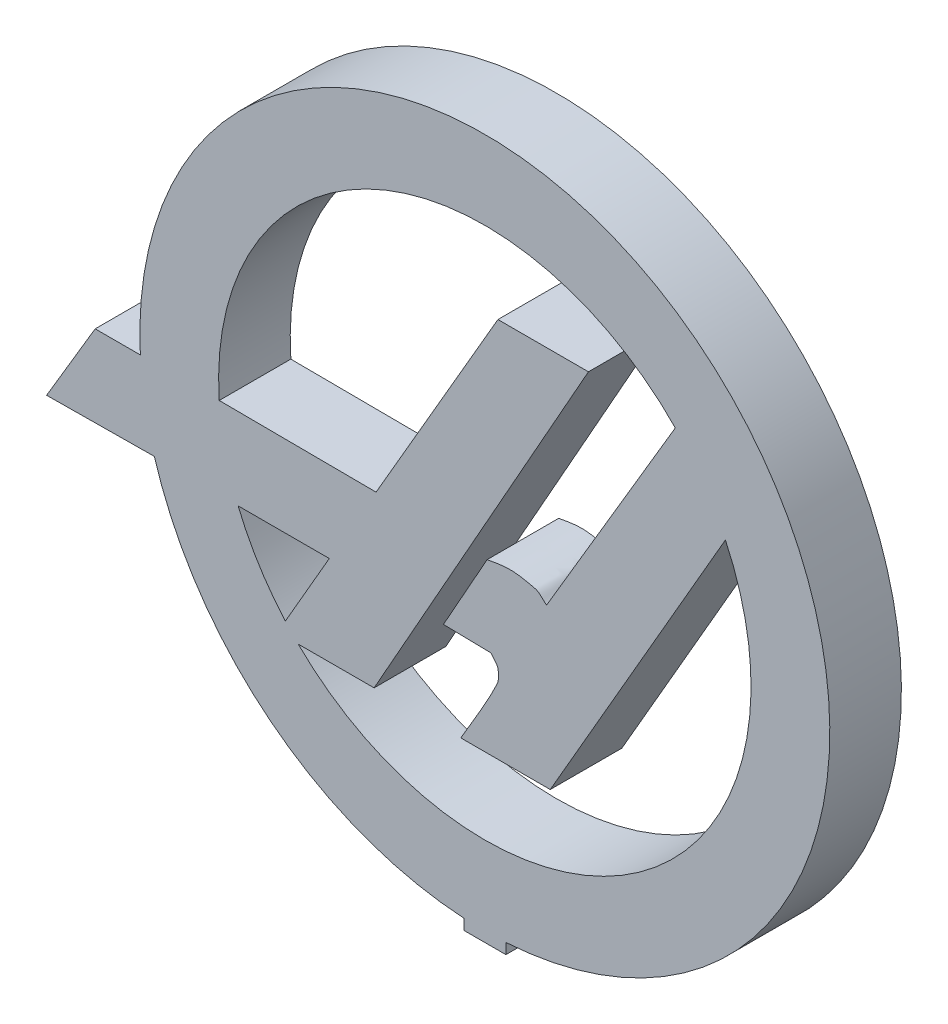
ISO-10303-21;
HEADER;
FILE_DESCRIPTION(('STEP AP214'),'2;1');
FILE_NAME('part.step','',(''),(''),'','','');
FILE_SCHEMA(('AUTOMOTIVE_DESIGN { 1 0 10303 214 1 1 1 1 }'));
ENDSEC;
DATA;
#1=APPLICATION_CONTEXT('core data for automotive mechanical design processes');
#2=APPLICATION_PROTOCOL_DEFINITION('international standard','automotive_design',2000,#1);
#3=PRODUCT_CONTEXT('',#1,'mechanical');
#4=PRODUCT('Part','Part','',(#3));
#5=PRODUCT_RELATED_PRODUCT_CATEGORY('part','',(#4));
#6=PRODUCT_DEFINITION_FORMATION('','',#4);
#7=PRODUCT_DEFINITION_CONTEXT('part definition',#1,'design');
#8=PRODUCT_DEFINITION('design','',#6,#7);
#9=PRODUCT_DEFINITION_SHAPE('','',#8);
#10=(LENGTH_UNIT() NAMED_UNIT(*) SI_UNIT(.MILLI.,.METRE.));
#11=(NAMED_UNIT(*) PLANE_ANGLE_UNIT() SI_UNIT($,.RADIAN.));
#12=(NAMED_UNIT(*) SI_UNIT($,.STERADIAN.) SOLID_ANGLE_UNIT());
#13=UNCERTAINTY_MEASURE_WITH_UNIT(LENGTH_MEASURE(1.E-05),#10,'distance_accuracy_value','');
#14=(GEOMETRIC_REPRESENTATION_CONTEXT(3) GLOBAL_UNCERTAINTY_ASSIGNED_CONTEXT((#13)) GLOBAL_UNIT_ASSIGNED_CONTEXT((#10,
#11,#12)) REPRESENTATION_CONTEXT('',''));
#15=CARTESIAN_POINT('',(0.,0.,0.));
#16=DIRECTION('',(0.,0.,1.));
#17=DIRECTION('',(1.,0.,0.));
#18=AXIS2_PLACEMENT_3D('',#15,#16,#17);
#19=CARTESIAN_POINT('',(429.035110328708,358.774337279412,38.2200510177394));
#20=DIRECTION('',(0.020467844201998,0.999790511734195,0.));
#21=DIRECTION('',(-0.999790511734195,0.020467844201998,0.));
#22=AXIS2_PLACEMENT_3D('',#19,#20,#21);
#23=PLANE('',#22);
#24=DIRECTION('',(0.999790511734195,-0.020467844201998,0.));
#25=VECTOR('',#24,1.);
#26=CARTESIAN_POINT('',(429.035110328708,358.774337279412,35.2800510177394));
#27=LINE('',#26,#25);
#28=CARTESIAN_POINT('',(445.37492535625,358.439826415037,35.2800510177394));
#29=VERTEX_POINT('',#28);
#30=CARTESIAN_POINT('',(447.32880091344,358.399826415012,35.2800510177394));
#31=VERTEX_POINT('',#30);
#32=EDGE_CURVE('E419',#29,#31,#27,.T.);
#33=ORIENTED_EDGE('',*,*,#32,.T.);
#34=DIRECTION('',(0.,0.,-1.));
#35=VECTOR('',#34,1.);
#36=CARTESIAN_POINT('',(447.32880091344,358.399826415012,38.2200510177394));
#37=LINE('',#36,#35);
#38=CARTESIAN_POINT('',(447.32880091344,358.399826415012,38.2200510177394));
#39=VERTEX_POINT('',#38);
#40=EDGE_CURVE('E11',#39,#31,#37,.T.);
#41=ORIENTED_EDGE('',*,*,#40,.F.);
#42=DIRECTION('',(0.999790511734195,-0.020467844201998,0.));
#43=VECTOR('',#42,1.);
#44=CARTESIAN_POINT('',(429.035110328708,358.774337279412,38.2200510177394));
#45=LINE('',#44,#43);
#46=CARTESIAN_POINT('',(445.37492535625,358.439826415037,38.2200510177394));
#47=VERTEX_POINT('',#46);
#48=EDGE_CURVE('E302',#47,#39,#45,.T.);
#49=ORIENTED_EDGE('',*,*,#48,.F.);
#50=DIRECTION('',(0.,0.,-1.));
#51=VECTOR('',#50,1.);
#52=CARTESIAN_POINT('',(445.37492535625,358.439826415037,38.2200510177394));
#53=LINE('',#52,#51);
#54=EDGE_CURVE('E360',#47,#29,#53,.T.);
#55=ORIENTED_EDGE('',*,*,#54,.T.);
#56=EDGE_LOOP('',(#33,#41,#49,#55));
#57=FACE_BOUND('',#56,.T.);
#58=ADVANCED_FACE('F37',(#57),#23,.F.);
#59=CARTESIAN_POINT('',(447.32880091344,358.399826415012,38.2200510177394));
#60=CARTESIAN_POINT('',(447.422134246773,358.266493081679,38.2200510177394));
#61=CARTESIAN_POINT('',(447.570818514459,358.158086410768,38.2200510177394));
#62=CARTESIAN_POINT('',(447.60880091344,357.999826415012,38.2200510177394));
#63=CARTESIAN_POINT('',(447.655579110257,357.804917261609,38.2200510177394));
#64=CARTESIAN_POINT('',(447.653933510983,357.581293267669,38.2200510177394));
#65=CARTESIAN_POINT('',(447.56880091344,357.399826415012,38.2200510177394));
#66=CARTESIAN_POINT('',(447.140322042841,356.486489875051,38.2200510177394));
#67=CARTESIAN_POINT('',(446.582134246773,355.639826415012,38.2200510177394));
#68=CARTESIAN_POINT('',(446.08880091344,354.759826415012,38.2200510177394));
#69=B_SPLINE_CURVE_WITH_KNOTS('',3,(#59,#60,#61,#62,#63,#64,#65,#66,#67,#68),.UNSPECIFIED.,.F.,
.F.,(4,3,3,4),(0.,1.,2.,3.),.UNSPECIFIED.);
#70=DIRECTION('',(0.,0.,-1.));
#71=VECTOR('',#70,1.);
#72=SURFACE_OF_LINEAR_EXTRUSION('',#69,#71);
#73=CARTESIAN_POINT('',(447.32880091344,358.399826415012,35.2800510177394));
#74=CARTESIAN_POINT('',(447.422134246773,358.266493081679,35.2800510177394));
#75=CARTESIAN_POINT('',(447.570818514459,358.158086410768,35.2800510177394));
#76=CARTESIAN_POINT('',(447.60880091344,357.999826415012,35.2800510177394));
#77=CARTESIAN_POINT('',(447.655579110257,357.804917261609,35.2800510177394));
#78=CARTESIAN_POINT('',(447.653933510983,357.581293267669,35.2800510177394));
#79=CARTESIAN_POINT('',(447.56880091344,357.399826415012,35.2800510177394));
#80=CARTESIAN_POINT('',(447.140322042841,356.486489875051,35.2800510177394));
#81=CARTESIAN_POINT('',(446.582134246773,355.639826415012,35.2800510177394));
#82=CARTESIAN_POINT('',(446.08880091344,354.759826415012,35.2800510177394));
#83=B_SPLINE_CURVE_WITH_KNOTS('',3,(#73,#74,#75,#76,#77,#78,#79,#80,#81,#82),.UNSPECIFIED.,.F.,
.F.,(4,3,3,4),(0.,1.,2.,3.),.UNSPECIFIED.);
#84=CARTESIAN_POINT('',(446.08880091344,354.759826415012,35.2800510177394));
#85=VERTEX_POINT('',#84);
#86=EDGE_CURVE('E422',#31,#85,#83,.T.);
#87=ORIENTED_EDGE('',*,*,#86,.T.);
#88=DIRECTION('',(0.,0.,-1.));
#89=VECTOR('',#88,1.);
#90=CARTESIAN_POINT('',(446.08880091344,354.759826415012,38.2200510177394));
#91=LINE('',#90,#89);
#92=CARTESIAN_POINT('',(446.08880091344,354.759826415012,38.2200510177394));
#93=VERTEX_POINT('',#92);
#94=EDGE_CURVE('E47',#93,#85,#91,.T.);
#95=ORIENTED_EDGE('',*,*,#94,.F.);
#96=EDGE_CURVE('E295',#39,#93,#69,.T.);
#97=ORIENTED_EDGE('',*,*,#96,.F.);
#98=ORIENTED_EDGE('',*,*,#40,.T.);
#99=EDGE_LOOP('',(#87,#95,#97,#98));
#100=FACE_BOUND('',#99,.T.);
#101=ADVANCED_FACE('F288',(#100),#72,.F.);
#102=CARTESIAN_POINT('',(428.808800913439,354.759826415012,38.2200510177394));
#103=DIRECTION('',(0.,1.,0.));
#104=DIRECTION('',(0.,0.,1.));
#105=AXIS2_PLACEMENT_3D('',#102,#103,#104);
#106=PLANE('',#105);
#107=DIRECTION('',(1.,0.,0.));
#108=VECTOR('',#107,1.);
#109=CARTESIAN_POINT('',(428.808800913439,354.759826415012,35.2800510177394));
#110=LINE('',#109,#108);
#111=CARTESIAN_POINT('',(449.760149876209,354.759826415012,35.2800510177394));
#112=VERTEX_POINT('',#111);
#113=EDGE_CURVE('E426',#85,#112,#110,.T.);
#114=ORIENTED_EDGE('',*,*,#113,.T.);
#115=DIRECTION('',(0.,0.,-1.));
#116=VECTOR('',#115,1.);
#117=CARTESIAN_POINT('',(449.760149876209,354.759826415012,38.2200510177394));
#118=LINE('',#117,#116);
#119=CARTESIAN_POINT('',(449.760149876209,354.759826415012,38.2200510177394));
#120=VERTEX_POINT('',#119);
#121=EDGE_CURVE('E348',#120,#112,#118,.T.);
#122=ORIENTED_EDGE('',*,*,#121,.F.);
#123=DIRECTION('',(1.,0.,0.));
#124=VECTOR('',#123,1.);
#125=CARTESIAN_POINT('',(428.808800913439,354.759826415012,38.2200510177394));
#126=LINE('',#125,#124);
#127=EDGE_CURVE('E301',#93,#120,#126,.T.);
#128=ORIENTED_EDGE('',*,*,#127,.F.);
#129=ORIENTED_EDGE('',*,*,#94,.T.);
#130=EDGE_LOOP('',(#114,#122,#128,#129));
#131=FACE_BOUND('',#130,.T.);
#132=ADVANCED_FACE('F284',(#131),#106,.F.);
#133=CARTESIAN_POINT('',(441.483641457042,340.40959906418,38.2200510177394));
#134=DIRECTION('',(-0.866250088911705,0.499610631852908,0.));
#135=DIRECTION('',(-0.499610631852908,-0.866250088911706,0.));
#136=AXIS2_PLACEMENT_3D('',#133,#134,#135);
#137=PLANE('',#136);
#138=DIRECTION('',(0.499610631852909,0.866250088911706,0.));
#139=VECTOR('',#138,1.);
#140=CARTESIAN_POINT('',(441.483641457042,340.40959906418,35.2800510177394));
#141=LINE('',#140,#139);
#142=CARTESIAN_POINT('',(456.953102289351,367.231329762156,35.2800510177394));
#143=VERTEX_POINT('',#142);
#144=EDGE_CURVE('E431',#112,#143,#141,.T.);
#145=ORIENTED_EDGE('',*,*,#144,.T.);
#146=DIRECTION('',(0.,0.,-1.));
#147=VECTOR('',#146,1.);
#148=CARTESIAN_POINT('',(456.953102289351,367.231329762156,38.2200510177394));
#149=LINE('',#148,#147);
#150=CARTESIAN_POINT('',(456.953102289351,367.231329762156,38.2200510177394));
#151=VERTEX_POINT('',#150);
#152=EDGE_CURVE('E346',#151,#143,#149,.T.);
#153=ORIENTED_EDGE('',*,*,#152,.F.);
#154=DIRECTION('',(0.499610631852909,0.866250088911706,0.));
#155=VECTOR('',#154,1.);
#156=CARTESIAN_POINT('',(441.483641457042,340.40959906418,38.2200510177394));
#157=LINE('',#156,#155);
#158=EDGE_CURVE('E308',#120,#151,#157,.T.);
#159=ORIENTED_EDGE('',*,*,#158,.F.);
#160=ORIENTED_EDGE('',*,*,#121,.T.);
#161=EDGE_LOOP('',(#145,#153,#159,#160));
#162=FACE_BOUND('',#161,.T.);
#163=ADVANCED_FACE('F280',(#162),#137,.F.);
#164=CARTESIAN_POINT('',(447.074162187186,362.551716003941,38.2200510177394));
#165=DIRECTION('',(0.,0.,-1.));
#166=DIRECTION('',(-1.,0.,0.));
#167=AXIS2_PLACEMENT_3D('',#164,#165,#166);
#168=CYLINDRICAL_SURFACE('',#167,10.9312507275352);
#169=CARTESIAN_POINT('',(447.074162187186,362.551716003941,35.2800510177394));
#170=DIRECTION('',(0.,0.,1.));
#171=DIRECTION('',(1.,0.,0.));
#172=AXIS2_PLACEMENT_3D('',#169,#170,#171);
#173=CIRCLE('',#172,10.9312507275352);
#174=CARTESIAN_POINT('',(439.408678136365,354.758603869829,35.2800510177394));
#175=VERTEX_POINT('',#174);
#176=EDGE_CURVE('E434',#175,#143,#173,.T.);
#177=ORIENTED_EDGE('',*,*,#176,.F.);
#178=DIRECTION('',(0.,0.,-1.));
#179=VECTOR('',#178,1.);
#180=CARTESIAN_POINT('',(439.408678136365,354.758603869829,38.2200510177394));
#181=LINE('',#180,#179);
#182=CARTESIAN_POINT('',(439.408678136365,354.758603869829,38.2200510177394));
#183=VERTEX_POINT('',#182);
#184=EDGE_CURVE('E344',#183,#175,#181,.T.);
#185=ORIENTED_EDGE('',*,*,#184,.F.);
#186=CARTESIAN_POINT('',(447.074162187186,362.551716003941,38.2200510177394));
#187=DIRECTION('',(0.,0.,1.));
#188=DIRECTION('',(1.,0.,0.));
#189=AXIS2_PLACEMENT_3D('',#186,#187,#188);
#190=CIRCLE('',#189,10.9312507275352);
#191=EDGE_CURVE('E310',#183,#151,#190,.T.);
#192=ORIENTED_EDGE('',*,*,#191,.T.);
#193=ORIENTED_EDGE('',*,*,#152,.T.);
#194=EDGE_LOOP('',(#177,#185,#192,#193));
#195=FACE_BOUND('',#194,.T.);
#196=ADVANCED_FACE('F276',(#195),#168,.F.);
#197=CARTESIAN_POINT('',(428.806044544312,354.754449450785,38.2200510177394));
#198=DIRECTION('',(-0.000391828944071524,0.999999923235036,0.));
#199=DIRECTION('',(-0.999999923235037,-0.000391828944071524,0.));
#200=AXIS2_PLACEMENT_3D('',#197,#198,#199);
#201=PLANE('',#200);
#202=DIRECTION('',(0.999999923235037,0.000391828944071524,0.));
#203=VECTOR('',#202,1.);
#204=CARTESIAN_POINT('',(428.806044544312,354.754449450785,35.2800510177394));
#205=LINE('',#204,#203);
#206=CARTESIAN_POINT('',(442.528777118936,354.759826415012,35.2800510177394));
#207=VERTEX_POINT('',#206);
#208=EDGE_CURVE('E437',#175,#207,#205,.T.);
#209=ORIENTED_EDGE('',*,*,#208,.T.);
#210=DIRECTION('',(0.,0.,-1.));
#211=VECTOR('',#210,1.);
#212=CARTESIAN_POINT('',(442.528777118936,354.759826415012,38.2200510177394));
#213=LINE('',#212,#211);
#214=CARTESIAN_POINT('',(442.528777118936,354.759826415012,38.2200510177394));
#215=VERTEX_POINT('',#214);
#216=EDGE_CURVE('E341',#215,#207,#213,.T.);
#217=ORIENTED_EDGE('',*,*,#216,.F.);
#218=DIRECTION('',(0.999999923235037,0.000391828944071524,0.));
#219=VECTOR('',#218,1.);
#220=CARTESIAN_POINT('',(428.806044544312,354.754449450785,38.2200510177394));
#221=LINE('',#220,#219);
#222=EDGE_CURVE('E313',#183,#215,#221,.T.);
#223=ORIENTED_EDGE('',*,*,#222,.F.);
#224=ORIENTED_EDGE('',*,*,#184,.T.);
#225=EDGE_LOOP('',(#209,#217,#223,#224));
#226=FACE_BOUND('',#225,.T.);
#227=ADVANCED_FACE('F272',(#226),#201,.F.);
#228=CARTESIAN_POINT('',(436.221022160488,343.549255868936,38.2200510177394));
#229=DIRECTION('',(-0.871515437445706,0.490368068183299,0.));
#230=DIRECTION('',(-0.490368068183299,-0.871515437445706,0.));
#231=AXIS2_PLACEMENT_3D('',#228,#229,#230);
#232=PLANE('',#231);
#233=DIRECTION('',(0.490368068183298,0.871515437445706,0.));
#234=VECTOR('',#233,1.);
#235=CARTESIAN_POINT('',(436.221022160488,343.549255868936,35.2800510177394));
#236=LINE('',#235,#234);
#237=CARTESIAN_POINT('',(451.328800913244,370.399826415506,35.2800510177394));
#238=VERTEX_POINT('',#237);
#239=EDGE_CURVE('E439',#207,#238,#236,.T.);
#240=ORIENTED_EDGE('',*,*,#239,.T.);
#241=DIRECTION('',(0.,0.,-1.));
#242=VECTOR('',#241,1.);
#243=CARTESIAN_POINT('',(451.328800913244,370.399826415506,38.2200510177394));
#244=LINE('',#243,#242);
#245=CARTESIAN_POINT('',(451.328800913244,370.399826415506,38.2200510177394));
#246=VERTEX_POINT('',#245);
#247=EDGE_CURVE('E338',#246,#238,#244,.T.);
#248=ORIENTED_EDGE('',*,*,#247,.F.);
#249=DIRECTION('',(0.490368068183298,0.871515437445706,0.));
#250=VECTOR('',#249,1.);
#251=CARTESIAN_POINT('',(436.221022160488,343.549255868936,38.2200510177394));
#252=LINE('',#251,#250);
#253=EDGE_CURVE('E315',#215,#246,#252,.T.);
#254=ORIENTED_EDGE('',*,*,#253,.F.);
#255=ORIENTED_EDGE('',*,*,#216,.T.);
#256=EDGE_LOOP('',(#240,#248,#254,#255));
#257=FACE_BOUND('',#256,.T.);
#258=ADVANCED_FACE('F268',(#257),#232,.F.);
#259=CARTESIAN_POINT('',(428.808800913439,370.399826415506,38.2200510177394));
#260=DIRECTION('',(0.,-1.,0.));
#261=DIRECTION('',(1.,0.,0.));
#262=AXIS2_PLACEMENT_3D('',#259,#260,#261);
#263=PLANE('',#262);
#264=DIRECTION('',(-1.,0.,0.));
#265=VECTOR('',#264,1.);
#266=CARTESIAN_POINT('',(428.808800913439,370.399826415506,35.2800510177394));
#267=LINE('',#266,#265);
#268=CARTESIAN_POINT('',(447.612030963726,370.399826415506,35.2800510177394));
#269=VERTEX_POINT('',#268);
#270=EDGE_CURVE('E441',#238,#269,#267,.T.);
#271=ORIENTED_EDGE('',*,*,#270,.T.);
#272=DIRECTION('',(0.,0.,-1.));
#273=VECTOR('',#272,1.);
#274=CARTESIAN_POINT('',(447.612030963726,370.399826415506,38.2200510177394));
#275=LINE('',#274,#273);
#276=CARTESIAN_POINT('',(447.612030963726,370.399826415506,38.2200510177394));
#277=VERTEX_POINT('',#276);
#278=EDGE_CURVE('E335',#277,#269,#275,.T.);
#279=ORIENTED_EDGE('',*,*,#278,.F.);
#280=DIRECTION('',(-1.,0.,0.));
#281=VECTOR('',#280,1.);
#282=CARTESIAN_POINT('',(428.808800913439,370.399826415506,38.2200510177394));
#283=LINE('',#282,#281);
#284=EDGE_CURVE('E317',#246,#277,#283,.T.);
#285=ORIENTED_EDGE('',*,*,#284,.F.);
#286=ORIENTED_EDGE('',*,*,#247,.T.);
#287=EDGE_LOOP('',(#271,#279,#285,#286));
#288=FACE_BOUND('',#287,.T.);
#289=ADVANCED_FACE('F264',(#288),#263,.F.);
#290=CARTESIAN_POINT('',(433.054753391416,345.261090647576,38.2200510177394));
#291=DIRECTION('',(0.865377431715627,-0.501120644832425,0.));
#292=DIRECTION('',(0.501120644832425,0.865377431715627,0.));
#293=AXIS2_PLACEMENT_3D('',#290,#291,#292);
#294=PLANE('',#293);
#295=DIRECTION('',(-0.501120644832425,-0.865377431715627,0.));
#296=VECTOR('',#295,1.);
#297=CARTESIAN_POINT('',(433.054753391416,345.261090647576,35.2800510177394));
#298=LINE('',#297,#296);
#299=CARTESIAN_POINT('',(442.608800913253,361.759826415488,35.2800510177394));
#300=VERTEX_POINT('',#299);
#301=EDGE_CURVE('E443',#269,#300,#298,.T.);
#302=ORIENTED_EDGE('',*,*,#301,.T.);
#303=DIRECTION('',(0.,0.,-1.));
#304=VECTOR('',#303,1.);
#305=CARTESIAN_POINT('',(442.608800913253,361.759826415488,38.2200510177394));
#306=LINE('',#305,#304);
#307=CARTESIAN_POINT('',(442.608800913253,361.759826415488,38.2200510177394));
#308=VERTEX_POINT('',#307);
#309=EDGE_CURVE('E329',#308,#300,#306,.T.);
#310=ORIENTED_EDGE('',*,*,#309,.F.);
#311=DIRECTION('',(-0.501120644832425,-0.865377431715627,0.));
#312=VECTOR('',#311,1.);
#313=CARTESIAN_POINT('',(433.054753391416,345.261090647576,38.2200510177394));
#314=LINE('',#313,#312);
#315=EDGE_CURVE('E319',#277,#308,#314,.T.);
#316=ORIENTED_EDGE('',*,*,#315,.F.);
#317=ORIENTED_EDGE('',*,*,#278,.T.);
#318=EDGE_LOOP('',(#302,#310,#316,#317));
#319=FACE_BOUND('',#318,.T.);
#320=ADVANCED_FACE('F260',(#319),#294,.F.);
#321=CARTESIAN_POINT('',(428.896534884587,361.844995769703,38.2200510177394));
#322=DIRECTION('',(-0.00621106031788096,-0.999980711178834,0.));
#323=DIRECTION('',(0.999980711178835,-0.00621106031788096,0.));
#324=AXIS2_PLACEMENT_3D('',#321,#322,#323);
#325=PLANE('',#324);
#326=DIRECTION('',(-0.999980711178835,0.00621106031788096,0.));
#327=VECTOR('',#326,1.);
#328=CARTESIAN_POINT('',(428.896534884587,361.844995769703,35.2800510177394));
#329=LINE('',#328,#327);
#330=CARTESIAN_POINT('',(436.168800913252,361.799826415487,35.2800510177394));
#331=VERTEX_POINT('',#330);
#332=EDGE_CURVE('E445',#300,#331,#329,.T.);
#333=ORIENTED_EDGE('',*,*,#332,.T.);
#334=DIRECTION('',(0.,0.,-1.));
#335=VECTOR('',#334,1.);
#336=CARTESIAN_POINT('',(436.168800913252,361.799826415487,38.2200510177394));
#337=LINE('',#336,#335);
#338=CARTESIAN_POINT('',(436.168800913252,361.799826415487,38.2200510177394));
#339=VERTEX_POINT('',#338);
#340=EDGE_CURVE('E324',#339,#331,#337,.T.);
#341=ORIENTED_EDGE('',*,*,#340,.F.);
#342=DIRECTION('',(-0.999980711178835,0.00621106031788096,0.));
#343=VECTOR('',#342,1.);
#344=CARTESIAN_POINT('',(428.896534884587,361.844995769703,38.2200510177394));
#345=LINE('',#344,#343);
#346=EDGE_CURVE('E321',#308,#339,#345,.T.);
#347=ORIENTED_EDGE('',*,*,#346,.F.);
#348=ORIENTED_EDGE('',*,*,#309,.T.);
#349=EDGE_LOOP('',(#333,#341,#347,#348));
#350=FACE_BOUND('',#349,.T.);
#351=ADVANCED_FACE('F256',(#350),#325,.F.);
#352=CARTESIAN_POINT('',(447.074162187186,362.551716003941,38.2200510177394));
#353=DIRECTION('',(0.,0.,-1.));
#354=DIRECTION('',(-1.,0.,0.));
#355=AXIS2_PLACEMENT_3D('',#352,#353,#354);
#356=CYLINDRICAL_SURFACE('',#355,10.9312507275352);
#357=CARTESIAN_POINT('',(447.074162187186,362.551716003941,35.2800510177394));
#358=DIRECTION('',(0.,0.,1.));
#359=DIRECTION('',(1.,0.,0.));
#360=AXIS2_PLACEMENT_3D('',#357,#358,#359);
#361=CIRCLE('',#360,10.9312507275352);
#362=CARTESIAN_POINT('',(454.896181152969,370.187700666522,35.2800510177394));
#363=VERTEX_POINT('',#362);
#364=EDGE_CURVE('E327',#363,#331,#361,.T.);
#365=ORIENTED_EDGE('',*,*,#364,.F.);
#366=DIRECTION('',(0.,0.,-1.));
#367=VECTOR('',#366,1.);
#368=CARTESIAN_POINT('',(454.896181152969,370.187700666522,38.2200510177394));
#369=LINE('',#368,#367);
#370=CARTESIAN_POINT('',(454.896181152969,370.187700666522,38.2200510177394));
#371=VERTEX_POINT('',#370);
#372=EDGE_CURVE('E229',#371,#363,#369,.T.);
#373=ORIENTED_EDGE('',*,*,#372,.F.);
#374=CARTESIAN_POINT('',(447.074162187186,362.551716003941,38.2200510177394));
#375=DIRECTION('',(0.,0.,1.));
#376=DIRECTION('',(1.,0.,0.));
#377=AXIS2_PLACEMENT_3D('',#374,#375,#376);
#378=CIRCLE('',#377,10.9312507275352);
#379=EDGE_CURVE('E222',#371,#339,#378,.T.);
#380=ORIENTED_EDGE('',*,*,#379,.T.);
#381=ORIENTED_EDGE('',*,*,#340,.T.);
#382=EDGE_LOOP('',(#365,#373,#380,#381));
#383=FACE_BOUND('',#382,.T.);
#384=ADVANCED_FACE('F253',(#383),#356,.F.);
#385=CARTESIAN_POINT('',(438.304176104864,342.108922892807,38.2200510177394));
#386=DIRECTION('',(0.860926528214315,-0.508729312126642,0.));
#387=DIRECTION('',(0.508729312126642,0.860926528214315,0.));
#388=AXIS2_PLACEMENT_3D('',#385,#386,#387);
#389=PLANE('',#388);
#390=DIRECTION('',(-0.508729312126642,-0.860926528214315,0.));
#391=VECTOR('',#390,1.);
#392=CARTESIAN_POINT('',(438.304176104864,342.108922892807,35.2800510177394));
#393=LINE('',#392,#391);
#394=CARTESIAN_POINT('',(449.60880091344,361.239826415012,35.2800510177394));
#395=VERTEX_POINT('',#394);
#396=EDGE_CURVE('E228',#363,#395,#393,.T.);
#397=ORIENTED_EDGE('',*,*,#396,.T.);
#398=DIRECTION('',(0.,0.,-1.));
#399=VECTOR('',#398,1.);
#400=CARTESIAN_POINT('',(449.60880091344,361.239826415012,38.2200510177394));
#401=LINE('',#400,#399);
#402=CARTESIAN_POINT('',(449.60880091344,361.239826415012,38.2200510177394));
#403=VERTEX_POINT('',#402);
#404=EDGE_CURVE('E225',#403,#395,#401,.T.);
#405=ORIENTED_EDGE('',*,*,#404,.F.);
#406=DIRECTION('',(-0.508729312126642,-0.860926528214315,0.));
#407=VECTOR('',#406,1.);
#408=CARTESIAN_POINT('',(438.304176104864,342.108922892807,38.2200510177394));
#409=LINE('',#408,#407);
#410=EDGE_CURVE('E216',#371,#403,#409,.T.);
#411=ORIENTED_EDGE('',*,*,#410,.F.);
#412=ORIENTED_EDGE('',*,*,#372,.T.);
#413=EDGE_LOOP('',(#397,#405,#411,#412));
#414=FACE_BOUND('',#413,.T.);
#415=ADVANCED_FACE('F226',(#414),#389,.F.);
#416=CARTESIAN_POINT('',(449.60880091344,361.239826415012,38.2200510177394));
#417=CARTESIAN_POINT('',(449.44880091344,361.359826415012,38.2200510177394));
#418=CARTESIAN_POINT('',(449.323060375766,361.552252669136,38.2200510177394));
#419=CARTESIAN_POINT('',(449.12880091344,361.599826415012,38.2200510177394));
#420=CARTESIAN_POINT('',(448.140568173316,361.841842596267,38.2200510177394));
#421=CARTESIAN_POINT('',(447.922870658819,361.765504705909,38.2200510177394));
#422=CARTESIAN_POINT('',(447.16880091344,361.639826415012,38.2200510177394));
#423=B_SPLINE_CURVE_WITH_KNOTS('',3,(#416,#417,#418,#419,#420,#421,#422),.UNSPECIFIED.,.F.,.F.,
(4,3,4),(0.,1.,2.),.UNSPECIFIED.);
#424=DIRECTION('',(0.,0.,-1.));
#425=VECTOR('',#424,1.);
#426=SURFACE_OF_LINEAR_EXTRUSION('',#423,#425);
#427=CARTESIAN_POINT('',(449.60880091344,361.239826415012,35.2800510177394));
#428=CARTESIAN_POINT('',(449.44880091344,361.359826415012,35.2800510177394));
#429=CARTESIAN_POINT('',(449.323060375766,361.552252669136,35.2800510177394));
#430=CARTESIAN_POINT('',(449.12880091344,361.599826415012,35.2800510177394));
#431=CARTESIAN_POINT('',(448.140568173316,361.841842596267,35.2800510177394));
#432=CARTESIAN_POINT('',(447.922870658819,361.765504705909,35.2800510177394));
#433=CARTESIAN_POINT('',(447.16880091344,361.639826415012,35.2800510177394));
#434=B_SPLINE_CURVE_WITH_KNOTS('',3,(#427,#428,#429,#430,#431,#432,#433),.UNSPECIFIED.,.F.,.F.,
(4,3,4),(0.,1.,2.),.UNSPECIFIED.);
#435=CARTESIAN_POINT('',(447.16880091344,361.639826415012,35.2800510177394));
#436=VERTEX_POINT('',#435);
#437=EDGE_CURVE('E136',#395,#436,#434,.T.);
#438=ORIENTED_EDGE('',*,*,#437,.T.);
#439=DIRECTION('',(0.,0.,-1.));
#440=VECTOR('',#439,1.);
#441=CARTESIAN_POINT('',(447.16880091344,361.639826415012,38.2200510177394));
#442=LINE('',#441,#440);
#443=CARTESIAN_POINT('',(447.16880091344,361.639826415012,38.2200510177394));
#444=VERTEX_POINT('',#443);
#445=EDGE_CURVE('E230',#444,#436,#442,.T.);
#446=ORIENTED_EDGE('',*,*,#445,.F.);
#447=EDGE_CURVE('E220',#403,#444,#423,.T.);
#448=ORIENTED_EDGE('',*,*,#447,.F.);
#449=ORIENTED_EDGE('',*,*,#404,.T.);
#450=EDGE_LOOP('',(#438,#446,#448,#449));
#451=FACE_BOUND('',#450,.T.);
#452=ADVANCED_FACE('F232',(#451),#426,.F.);
#453=CARTESIAN_POINT('',(447.074162187186,362.551716003941,38.2200510177394));
#454=DIRECTION('',(0.,0.,-1.));
#455=DIRECTION('',(-1.,0.,0.));
#456=AXIS2_PLACEMENT_3D('',#453,#454,#455);
#457=CYLINDRICAL_SURFACE('',#456,10.9312507275352);
#458=CARTESIAN_POINT('',(447.074162187186,362.551716003941,35.2800510177394));
#459=DIRECTION('',(0.,0.,1.));
#460=DIRECTION('',(1.,0.,0.));
#461=AXIS2_PLACEMENT_3D('',#458,#459,#460);
#462=CIRCLE('',#461,10.9312507275352);
#463=CARTESIAN_POINT('',(436.945756267353,358.439826415037,35.2800510177394));
#464=VERTEX_POINT('',#463);
#465=CARTESIAN_POINT('',(438.884172906698,355.311804536684,35.2800510177394));
#466=VERTEX_POINT('',#465);
#467=EDGE_CURVE('E410',#464,#466,#462,.T.);
#468=ORIENTED_EDGE('',*,*,#467,.F.);
#469=DIRECTION('',(0.,0.,-1.));
#470=VECTOR('',#469,1.);
#471=CARTESIAN_POINT('',(436.945756267353,358.439826415037,38.2200510177394));
#472=LINE('',#471,#470);
#473=CARTESIAN_POINT('',(436.945756267353,358.439826415037,38.2200510177394));
#474=VERTEX_POINT('',#473);
#475=EDGE_CURVE('E358',#474,#464,#472,.T.);
#476=ORIENTED_EDGE('',*,*,#475,.F.);
#477=CARTESIAN_POINT('',(447.074162187186,362.551716003941,38.2200510177394));
#478=DIRECTION('',(0.,0.,1.));
#479=DIRECTION('',(1.,0.,0.));
#480=AXIS2_PLACEMENT_3D('',#477,#478,#479);
#481=CIRCLE('',#480,10.9312507275352);
#482=CARTESIAN_POINT('',(438.884172906698,355.311804536684,38.2200510177394));
#483=VERTEX_POINT('',#482);
#484=EDGE_CURVE('E469',#474,#483,#481,.T.);
#485=ORIENTED_EDGE('',*,*,#484,.T.);
#486=DIRECTION('',(0.,0.,-1.));
#487=VECTOR('',#486,1.);
#488=CARTESIAN_POINT('',(438.884172906698,355.311804536684,38.2200510177394));
#489=LINE('',#488,#487);
#490=EDGE_CURVE('E353',#483,#466,#489,.T.);
#491=ORIENTED_EDGE('',*,*,#490,.T.);
#492=EDGE_LOOP('',(#468,#476,#485,#491));
#493=FACE_BOUND('',#492,.T.);
#494=ADVANCED_FACE('F248',(#493),#457,.F.);
#495=CARTESIAN_POINT('',(428.808800913439,358.439826415037,38.2200510177394));
#496=DIRECTION('',(0.,1.,0.));
#497=DIRECTION('',(0.,0.,1.));
#498=AXIS2_PLACEMENT_3D('',#495,#496,#497);
#499=PLANE('',#498);
#500=DIRECTION('',(1.,0.,0.));
#501=VECTOR('',#500,1.);
#502=CARTESIAN_POINT('',(428.808800913439,358.439826415037,35.2800510177394));
#503=LINE('',#502,#501);
#504=CARTESIAN_POINT('',(440.68880091344,358.439826415037,35.2800510177394));
#505=VERTEX_POINT('',#504);
#506=EDGE_CURVE('E413',#464,#505,#503,.T.);
#507=ORIENTED_EDGE('',*,*,#506,.T.);
#508=DIRECTION('',(0.,0.,-1.));
#509=VECTOR('',#508,1.);
#510=CARTESIAN_POINT('',(440.68880091344,358.439826415037,38.2200510177394));
#511=LINE('',#510,#509);
#512=CARTESIAN_POINT('',(440.68880091344,358.439826415037,38.2200510177394));
#513=VERTEX_POINT('',#512);
#514=EDGE_CURVE('E355',#513,#505,#511,.T.);
#515=ORIENTED_EDGE('',*,*,#514,.F.);
#516=DIRECTION('',(1.,0.,0.));
#517=VECTOR('',#516,1.);
#518=CARTESIAN_POINT('',(428.808800913439,358.439826415037,38.2200510177394));
#519=LINE('',#518,#517);
#520=EDGE_CURVE('E464',#474,#513,#519,.T.);
#521=ORIENTED_EDGE('',*,*,#520,.F.);
#522=ORIENTED_EDGE('',*,*,#475,.T.);
#523=EDGE_LOOP('',(#507,#515,#521,#522));
#524=FACE_BOUND('',#523,.T.);
#525=ADVANCED_FACE('F578',(#524),#499,.F.);
#526=CARTESIAN_POINT('',(428.714756697895,358.436612009656,38.2200510177394));
#527=DIRECTION('',(0.00877507475080324,-0.999961498290368,0.));
#528=DIRECTION('',(0.999961498290368,0.00877507475080324,0.));
#529=AXIS2_PLACEMENT_3D('',#526,#527,#528);
#530=PLANE('',#529);
#531=DIRECTION('',(-0.999961498290368,-0.00877507475080324,0.));
#532=VECTOR('',#531,1.);
#533=CARTESIAN_POINT('',(428.714756697895,358.436612009656,35.2800510177394));
#534=LINE('',#533,#532);
#535=CARTESIAN_POINT('',(433.507038576353,358.478666260527,35.2800510177394));
#536=VERTEX_POINT('',#535);
#537=CARTESIAN_POINT('',(429.081053477403,358.439826415037,35.2800510177394));
#538=VERTEX_POINT('',#537);
#539=EDGE_CURVE('E392',#536,#538,#534,.T.);
#540=ORIENTED_EDGE('',*,*,#539,.F.);
#541=DIRECTION('',(0.,0.,-1.));
#542=VECTOR('',#541,1.);
#543=CARTESIAN_POINT('',(433.507038576353,358.478666260527,38.2200510177394));
#544=LINE('',#543,#542);
#545=CARTESIAN_POINT('',(433.507038576353,358.478666260527,38.2200510177394));
#546=VERTEX_POINT('',#545);
#547=EDGE_CURVE('E41',#546,#536,#544,.T.);
#548=ORIENTED_EDGE('',*,*,#547,.F.);
#549=DIRECTION('',(-0.999961498290368,-0.00877507475080324,0.));
#550=VECTOR('',#549,1.);
#551=CARTESIAN_POINT('',(428.714756697895,358.436612009656,38.2200510177394));
#552=LINE('',#551,#550);
#553=CARTESIAN_POINT('',(429.081053477403,358.439826415037,38.2200510177394));
#554=VERTEX_POINT('',#553);
#555=EDGE_CURVE('E456',#546,#554,#552,.T.);
#556=ORIENTED_EDGE('',*,*,#555,.T.);
#557=DIRECTION('',(0.,0.,-1.));
#558=VECTOR('',#557,1.);
#559=CARTESIAN_POINT('',(429.081053477403,358.439826415037,38.2200510177394));
#560=LINE('',#559,#558);
#561=EDGE_CURVE('E234',#554,#538,#560,.T.);
#562=ORIENTED_EDGE('',*,*,#561,.T.);
#563=EDGE_LOOP('',(#540,#548,#556,#562));
#564=FACE_BOUND('',#563,.T.);
#565=ADVANCED_FACE('F39',(#564),#530,.T.);
#566=CARTESIAN_POINT('',(447.074162187186,362.551716003941,38.2200510177394));
#567=DIRECTION('',(0.,0.,-1.));
#568=DIRECTION('',(-1.,0.,0.));
#569=AXIS2_PLACEMENT_3D('',#566,#567,#568);
#570=CYLINDRICAL_SURFACE('',#569,14.1653301156013);
#571=CARTESIAN_POINT('',(447.074162187186,362.551716003941,35.2800510177394));
#572=DIRECTION('',(0.,0.,1.));
#573=DIRECTION('',(1.,0.,0.));
#574=AXIS2_PLACEMENT_3D('',#571,#572,#573);
#575=CIRCLE('',#574,14.1653301156013);
#576=CARTESIAN_POINT('',(446.20916225181,348.412820983616,35.2800510177394));
#577=VERTEX_POINT('',#576);
#578=EDGE_CURVE('E383',#536,#577,#575,.T.);
#579=ORIENTED_EDGE('',*,*,#578,.T.);
#580=DIRECTION('',(0.,0.,-1.));
#581=VECTOR('',#580,1.);
#582=CARTESIAN_POINT('',(446.20916225181,348.412820983616,38.2200510177394));
#583=LINE('',#582,#581);
#584=CARTESIAN_POINT('',(446.20916225181,348.412820983616,38.2200510177394));
#585=VERTEX_POINT('',#584);
#586=EDGE_CURVE('E374',#585,#577,#583,.T.);
#587=ORIENTED_EDGE('',*,*,#586,.F.);
#588=CARTESIAN_POINT('',(447.074162187186,362.551716003941,38.2200510177394));
#589=DIRECTION('',(0.,0.,1.));
#590=DIRECTION('',(1.,0.,0.));
#591=AXIS2_PLACEMENT_3D('',#588,#589,#590);
#592=CIRCLE('',#591,14.1653301156013);
#593=EDGE_CURVE('E385',#546,#585,#592,.T.);
#594=ORIENTED_EDGE('',*,*,#593,.F.);
#595=ORIENTED_EDGE('',*,*,#547,.T.);
#596=EDGE_LOOP('',(#579,#587,#594,#595));
#597=FACE_BOUND('',#596,.T.);
#598=ADVANCED_FACE('F382',(#597),#570,.T.);
#599=CARTESIAN_POINT('',(446.20916225181,347.719826415013,38.2200510177394));
#600=DIRECTION('',(-1.,0.,0.));
#601=DIRECTION('',(0.,0.,1.));
#602=AXIS2_PLACEMENT_3D('',#599,#600,#601);
#603=PLANE('',#602);
#604=DIRECTION('',(0.,1.,0.));
#605=VECTOR('',#604,1.);
#606=CARTESIAN_POINT('',(446.20916225181,347.719826415013,35.2800510177394));
#607=LINE('',#606,#605);
#608=CARTESIAN_POINT('',(446.20916225181,347.978211043076,35.2800510177394));
#609=VERTEX_POINT('',#608);
#610=EDGE_CURVE('E395',#609,#577,#607,.T.);
#611=ORIENTED_EDGE('',*,*,#610,.F.);
#612=DIRECTION('',(0.,0.,-1.));
#613=VECTOR('',#612,1.);
#614=CARTESIAN_POINT('',(446.20916225181,347.978211043076,38.2200510177394));
#615=LINE('',#614,#613);
#616=CARTESIAN_POINT('',(446.20916225181,347.978211043076,38.2200510177394));
#617=VERTEX_POINT('',#616);
#618=EDGE_CURVE('E373',#617,#609,#615,.T.);
#619=ORIENTED_EDGE('',*,*,#618,.F.);
#620=DIRECTION('',(0.,1.,0.));
#621=VECTOR('',#620,1.);
#622=CARTESIAN_POINT('',(446.20916225181,347.719826415013,38.2200510177394));
#623=LINE('',#622,#621);
#624=EDGE_CURVE('E485',#617,#585,#623,.T.);
#625=ORIENTED_EDGE('',*,*,#624,.T.);
#626=ORIENTED_EDGE('',*,*,#586,.T.);
#627=EDGE_LOOP('',(#611,#619,#625,#626));
#628=FACE_BOUND('',#627,.T.);
#629=ADVANCED_FACE('F509',(#628),#603,.T.);
#630=CARTESIAN_POINT('',(428.808800913439,347.978211043076,38.2200510177394));
#631=DIRECTION('',(0.,1.,0.));
#632=DIRECTION('',(0.,0.,1.));
#633=AXIS2_PLACEMENT_3D('',#630,#631,#632);
#634=PLANE('',#633);
#635=DIRECTION('',(1.,0.,0.));
#636=VECTOR('',#635,1.);
#637=CARTESIAN_POINT('',(428.808800913439,347.978211043076,35.2800510177394));
#638=LINE('',#637,#636);
#639=CARTESIAN_POINT('',(447.939162187186,347.978211043076,35.2800510177394));
#640=VERTEX_POINT('',#639);
#641=EDGE_CURVE('E399',#609,#640,#638,.T.);
#642=ORIENTED_EDGE('',*,*,#641,.T.);
#643=DIRECTION('',(0.,0.,-1.));
#644=VECTOR('',#643,1.);
#645=CARTESIAN_POINT('',(447.939162187186,347.978211043076,38.2200510177394));
#646=LINE('',#645,#644);
#647=CARTESIAN_POINT('',(447.939162187186,347.978211043076,38.2200510177394));
#648=VERTEX_POINT('',#647);
#649=EDGE_CURVE('E370',#648,#640,#646,.T.);
#650=ORIENTED_EDGE('',*,*,#649,.F.);
#651=DIRECTION('',(1.,0.,0.));
#652=VECTOR('',#651,1.);
#653=CARTESIAN_POINT('',(428.808800913439,347.978211043076,38.2200510177394));
#654=LINE('',#653,#652);
#655=EDGE_CURVE('E483',#617,#648,#654,.T.);
#656=ORIENTED_EDGE('',*,*,#655,.F.);
#657=ORIENTED_EDGE('',*,*,#618,.T.);
#658=EDGE_LOOP('',(#642,#650,#656,#657));
#659=FACE_BOUND('',#658,.T.);
#660=ADVANCED_FACE('F512',(#659),#634,.F.);
#661=CARTESIAN_POINT('',(447.939162187186,347.719826415013,38.2200510177394));
#662=DIRECTION('',(-1.,0.,0.));
#663=DIRECTION('',(0.,0.,1.));
#664=AXIS2_PLACEMENT_3D('',#661,#662,#663);
#665=PLANE('',#664);
#666=DIRECTION('',(0.,1.,0.));
#667=VECTOR('',#666,1.);
#668=CARTESIAN_POINT('',(447.939162187186,347.719826415013,35.2800510177394));
#669=LINE('',#668,#667);
#670=CARTESIAN_POINT('',(447.939162187186,348.41282098757,35.2800510177394));
#671=VERTEX_POINT('',#670);
#672=EDGE_CURVE('E401',#640,#671,#669,.T.);
#673=ORIENTED_EDGE('',*,*,#672,.T.);
#674=DIRECTION('',(0.,0.,-1.));
#675=VECTOR('',#674,1.);
#676=CARTESIAN_POINT('',(447.939162187186,348.41282098757,38.2200510177394));
#677=LINE('',#676,#675);
#678=CARTESIAN_POINT('',(447.939162187186,348.41282098757,38.2200510177394));
#679=VERTEX_POINT('',#678);
#680=EDGE_CURVE('E367',#679,#671,#677,.T.);
#681=ORIENTED_EDGE('',*,*,#680,.F.);
#682=DIRECTION('',(0.,1.,0.));
#683=VECTOR('',#682,1.);
#684=CARTESIAN_POINT('',(447.939162187186,347.719826415013,38.2200510177394));
#685=LINE('',#684,#683);
#686=EDGE_CURVE('E481',#648,#679,#685,.T.);
#687=ORIENTED_EDGE('',*,*,#686,.F.);
#688=ORIENTED_EDGE('',*,*,#649,.T.);
#689=EDGE_LOOP('',(#673,#681,#687,#688));
#690=FACE_BOUND('',#689,.T.);
#691=ADVANCED_FACE('F506',(#690),#665,.F.);
#692=CARTESIAN_POINT('',(447.074162187186,362.551716003941,38.2200510177394));
#693=DIRECTION('',(0.,0.,-1.));
#694=DIRECTION('',(-1.,0.,0.));
#695=AXIS2_PLACEMENT_3D('',#692,#693,#694);
#696=CYLINDRICAL_SURFACE('',#695,14.1653301156013);
#697=CARTESIAN_POINT('',(447.074162187186,362.551716003941,35.2800510177394));
#698=DIRECTION('',(0.,0.,1.));
#699=DIRECTION('',(1.,0.,0.));
#700=AXIS2_PLACEMENT_3D('',#697,#698,#699);
#701=CIRCLE('',#700,14.1653301156013);
#702=CARTESIAN_POINT('',(432.928801133822,361.799826415014,35.2800510177394));
#703=VERTEX_POINT('',#702);
#704=EDGE_CURVE('E403',#671,#703,#701,.T.);
#705=ORIENTED_EDGE('',*,*,#704,.T.);
#706=DIRECTION('',(0.,0.,-1.));
#707=VECTOR('',#706,1.);
#708=CARTESIAN_POINT('',(432.928801133822,361.799826415014,38.2200510177394));
#709=LINE('',#708,#707);
#710=CARTESIAN_POINT('',(432.928801133822,361.799826415014,38.2200510177394));
#711=VERTEX_POINT('',#710);
#712=EDGE_CURVE('E364',#711,#703,#709,.T.);
#713=ORIENTED_EDGE('',*,*,#712,.F.);
#714=CARTESIAN_POINT('',(447.074162187186,362.551716003941,38.2200510177394));
#715=DIRECTION('',(0.,0.,1.));
#716=DIRECTION('',(1.,0.,0.));
#717=AXIS2_PLACEMENT_3D('',#714,#715,#716);
#718=CIRCLE('',#717,14.1653301156013);
#719=EDGE_CURVE('E479',#679,#711,#718,.T.);
#720=ORIENTED_EDGE('',*,*,#719,.F.);
#721=ORIENTED_EDGE('',*,*,#680,.T.);
#722=EDGE_LOOP('',(#705,#713,#720,#721));
#723=FACE_BOUND('',#722,.T.);
#724=ADVANCED_FACE('F502',(#723),#696,.T.);
#725=CARTESIAN_POINT('',(428.808800913439,361.799826415014,38.2200510177394));
#726=DIRECTION('',(0.,-1.,0.));
#727=DIRECTION('',(0.,0.,-1.));
#728=AXIS2_PLACEMENT_3D('',#725,#726,#727);
#729=PLANE('',#728);
#730=DIRECTION('',(-1.,0.,0.));
#731=VECTOR('',#730,1.);
#732=CARTESIAN_POINT('',(428.808800913439,361.799826415014,35.2800510177394));
#733=LINE('',#732,#731);
#734=CARTESIAN_POINT('',(431.074422828612,361.799826415014,35.2800510177394));
#735=VERTEX_POINT('',#734);
#736=EDGE_CURVE('E405',#703,#735,#733,.T.);
#737=ORIENTED_EDGE('',*,*,#736,.T.);
#738=DIRECTION('',(0.,0.,-1.));
#739=VECTOR('',#738,1.);
#740=CARTESIAN_POINT('',(431.074422828612,361.799826415014,38.2200510177394));
#741=LINE('',#740,#739);
#742=CARTESIAN_POINT('',(431.074422828612,361.799826415014,38.2200510177394));
#743=VERTEX_POINT('',#742);
#744=EDGE_CURVE('E362',#743,#735,#741,.T.);
#745=ORIENTED_EDGE('',*,*,#744,.F.);
#746=DIRECTION('',(-1.,0.,0.));
#747=VECTOR('',#746,1.);
#748=CARTESIAN_POINT('',(428.808800913439,361.799826415014,38.2200510177394));
#749=LINE('',#748,#747);
#750=EDGE_CURVE('E477',#711,#743,#749,.T.);
#751=ORIENTED_EDGE('',*,*,#750,.F.);
#752=ORIENTED_EDGE('',*,*,#712,.T.);
#753=EDGE_LOOP('',(#737,#745,#751,#752));
#754=FACE_BOUND('',#753,.T.);
#755=ADVANCED_FACE('F498',(#754),#729,.F.);
#756=CARTESIAN_POINT('',(433.081919670366,345.254565593709,38.2200510177394));
#757=DIRECTION('',(0.866185586048601,-0.499722453489577,0.));
#758=DIRECTION('',(0.499722453489577,0.866185586048601,0.));
#759=AXIS2_PLACEMENT_3D('',#756,#757,#758);
#760=PLANE('',#759);
#761=DIRECTION('',(-0.499722453489577,-0.866185586048601,0.));
#762=VECTOR('',#761,1.);
#763=CARTESIAN_POINT('',(433.081919670366,345.254565593709,35.2800510177394));
#764=LINE('',#763,#762);
#765=EDGE_CURVE('E416',#505,#466,#764,.T.);
#766=ORIENTED_EDGE('',*,*,#765,.T.);
#767=ORIENTED_EDGE('',*,*,#490,.F.);
#768=DIRECTION('',(-0.499722453489577,-0.866185586048601,0.));
#769=VECTOR('',#768,1.);
#770=CARTESIAN_POINT('',(433.081919670366,345.254565593709,38.2200510177394));
#771=LINE('',#770,#769);
#772=EDGE_CURVE('E463',#513,#483,#771,.T.);
#773=ORIENTED_EDGE('',*,*,#772,.F.);
#774=ORIENTED_EDGE('',*,*,#514,.T.);
#775=EDGE_LOOP('',(#766,#767,#773,#774));
#776=FACE_BOUND('',#775,.T.);
#777=ADVANCED_FACE('F628',(#776),#760,.F.);
#778=CARTESIAN_POINT('',(424.306055693651,350.391146152361,38.2200510177394));
#779=DIRECTION('',(-0.860037916766267,0.510230126241424,0.));
#780=DIRECTION('',(-0.510230126241424,-0.860037916766267,0.));
#781=AXIS2_PLACEMENT_3D('',#778,#779,#780);
#782=PLANE('',#781);
#783=DIRECTION('',(0.510230126241424,0.860037916766267,0.));
#784=VECTOR('',#783,1.);
#785=CARTESIAN_POINT('',(424.306055693651,350.391146152361,35.2800510177394));
#786=LINE('',#785,#784);
#787=EDGE_CURVE('E408',#538,#735,#786,.T.);
#788=ORIENTED_EDGE('',*,*,#787,.F.);
#789=ORIENTED_EDGE('',*,*,#561,.F.);
#790=DIRECTION('',(0.510230126241424,0.860037916766267,0.));
#791=VECTOR('',#790,1.);
#792=CARTESIAN_POINT('',(424.306055693651,350.391146152361,38.2200510177394));
#793=LINE('',#792,#791);
#794=EDGE_CURVE('E474',#554,#743,#793,.T.);
#795=ORIENTED_EDGE('',*,*,#794,.T.);
#796=ORIENTED_EDGE('',*,*,#744,.T.);
#797=EDGE_LOOP('',(#788,#789,#795,#796));
#798=FACE_BOUND('',#797,.T.);
#799=ADVANCED_FACE('F493',(#798),#782,.T.);
#800=CARTESIAN_POINT('',(436.841204792304,343.216972357547,38.2200510177394));
#801=DIRECTION('',(0.872287975009376,-0.488992524128992,0.));
#802=DIRECTION('',(0.488992524128992,0.872287975009376,0.));
#803=AXIS2_PLACEMENT_3D('',#800,#801,#802);
#804=PLANE('',#803);
#805=DIRECTION('',(-0.488992524128992,-0.872287975009376,0.));
#806=VECTOR('',#805,1.);
#807=CARTESIAN_POINT('',(436.841204792304,343.216972357547,35.2800510177394));
#808=LINE('',#807,#806);
#809=EDGE_CURVE('E142',#436,#29,#808,.T.);
#810=ORIENTED_EDGE('',*,*,#809,.T.);
#811=ORIENTED_EDGE('',*,*,#54,.F.);
#812=DIRECTION('',(-0.488992524128992,-0.872287975009376,0.));
#813=VECTOR('',#812,1.);
#814=CARTESIAN_POINT('',(436.841204792304,343.216972357547,38.2200510177394));
#815=LINE('',#814,#813);
#816=EDGE_CURVE('E56',#444,#47,#815,.T.);
#817=ORIENTED_EDGE('',*,*,#816,.F.);
#818=ORIENTED_EDGE('',*,*,#445,.T.);
#819=EDGE_LOOP('',(#810,#811,#817,#818));
#820=FACE_BOUND('',#819,.T.);
#821=ADVANCED_FACE('F249',(#820),#804,.F.);
#822=CARTESIAN_POINT('',(428.808800913439,347.719826415013,38.2200510177394));
#823=DIRECTION('',(0.,0.,1.));
#824=DIRECTION('',(1.,0.,0.));
#825=AXIS2_PLACEMENT_3D('',#822,#823,#824);
#826=PLANE('',#825);
#827=ORIENTED_EDGE('',*,*,#555,.F.);
#828=ORIENTED_EDGE('',*,*,#593,.T.);
#829=ORIENTED_EDGE('',*,*,#624,.F.);
#830=ORIENTED_EDGE('',*,*,#655,.T.);
#831=ORIENTED_EDGE('',*,*,#686,.T.);
#832=ORIENTED_EDGE('',*,*,#719,.T.);
#833=ORIENTED_EDGE('',*,*,#750,.T.);
#834=ORIENTED_EDGE('',*,*,#794,.F.);
#835=EDGE_LOOP('',(#827,#828,#829,#830,#831,#832,#833,#834));
#836=FACE_BOUND('',#835,.T.);
#837=ORIENTED_EDGE('',*,*,#484,.F.);
#838=ORIENTED_EDGE('',*,*,#520,.T.);
#839=ORIENTED_EDGE('',*,*,#772,.T.);
#840=EDGE_LOOP('',(#837,#838,#839));
#841=FACE_BOUND('',#840,.T.);
#842=ORIENTED_EDGE('',*,*,#48,.T.);
#843=ORIENTED_EDGE('',*,*,#96,.T.);
#844=ORIENTED_EDGE('',*,*,#127,.T.);
#845=ORIENTED_EDGE('',*,*,#158,.T.);
#846=ORIENTED_EDGE('',*,*,#191,.F.);
#847=ORIENTED_EDGE('',*,*,#222,.T.);
#848=ORIENTED_EDGE('',*,*,#253,.T.);
#849=ORIENTED_EDGE('',*,*,#284,.T.);
#850=ORIENTED_EDGE('',*,*,#315,.T.);
#851=ORIENTED_EDGE('',*,*,#346,.T.);
#852=ORIENTED_EDGE('',*,*,#379,.F.);
#853=ORIENTED_EDGE('',*,*,#410,.T.);
#854=ORIENTED_EDGE('',*,*,#447,.T.);
#855=ORIENTED_EDGE('',*,*,#816,.T.);
#856=EDGE_LOOP('',(#842,#843,#844,#845,#846,#847,#848,#849,#850,#851,#852,#853,#854,#855));
#857=FACE_BOUND('',#856,.T.);
#858=ADVANCED_FACE('F218',(#836,#841,#857),#826,.T.);
#859=CARTESIAN_POINT('',(428.808800913439,347.719826415013,35.2800510177394));
#860=DIRECTION('',(0.,0.,1.));
#861=DIRECTION('',(1.,0.,0.));
#862=AXIS2_PLACEMENT_3D('',#859,#860,#861);
#863=PLANE('',#862);
#864=ORIENTED_EDGE('',*,*,#539,.T.);
#865=ORIENTED_EDGE('',*,*,#787,.T.);
#866=ORIENTED_EDGE('',*,*,#736,.F.);
#867=ORIENTED_EDGE('',*,*,#704,.F.);
#868=ORIENTED_EDGE('',*,*,#672,.F.);
#869=ORIENTED_EDGE('',*,*,#641,.F.);
#870=ORIENTED_EDGE('',*,*,#610,.T.);
#871=ORIENTED_EDGE('',*,*,#578,.F.);
#872=EDGE_LOOP('',(#864,#865,#866,#867,#868,#869,#870,#871));
#873=FACE_BOUND('',#872,.T.);
#874=ORIENTED_EDGE('',*,*,#467,.T.);
#875=ORIENTED_EDGE('',*,*,#765,.F.);
#876=ORIENTED_EDGE('',*,*,#506,.F.);
#877=EDGE_LOOP('',(#874,#875,#876));
#878=FACE_BOUND('',#877,.T.);
#879=ORIENTED_EDGE('',*,*,#32,.F.);
#880=ORIENTED_EDGE('',*,*,#809,.F.);
#881=ORIENTED_EDGE('',*,*,#437,.F.);
#882=ORIENTED_EDGE('',*,*,#396,.F.);
#883=ORIENTED_EDGE('',*,*,#364,.T.);
#884=ORIENTED_EDGE('',*,*,#332,.F.);
#885=ORIENTED_EDGE('',*,*,#301,.F.);
#886=ORIENTED_EDGE('',*,*,#270,.F.);
#887=ORIENTED_EDGE('',*,*,#239,.F.);
#888=ORIENTED_EDGE('',*,*,#208,.F.);
#889=ORIENTED_EDGE('',*,*,#176,.T.);
#890=ORIENTED_EDGE('',*,*,#144,.F.);
#891=ORIENTED_EDGE('',*,*,#113,.F.);
#892=ORIENTED_EDGE('',*,*,#86,.F.);
#893=EDGE_LOOP('',(#879,#880,#881,#882,#883,#884,#885,#886,#887,#888,#889,#890,#891,#892));
#894=FACE_BOUND('',#893,.T.);
#895=ADVANCED_FACE('F389',(#873,#878,#894),#863,.F.);
#896=CLOSED_SHELL('',(#58,#101,#132,#163,#196,#227,#258,#289,#320,#351,#384,#415,#452,#494,#525,
#565,#598,#629,#660,#691,#724,#755,#777,#799,#821,#858,#895));
#897=MANIFOLD_SOLID_BREP('B2',#896);
#898=ADVANCED_BREP_SHAPE_REPRESENTATION('',(#18,#897),#14);
#899=SHAPE_DEFINITION_REPRESENTATION(#9,#898);
ENDSEC;
END-ISO-10303-21;
